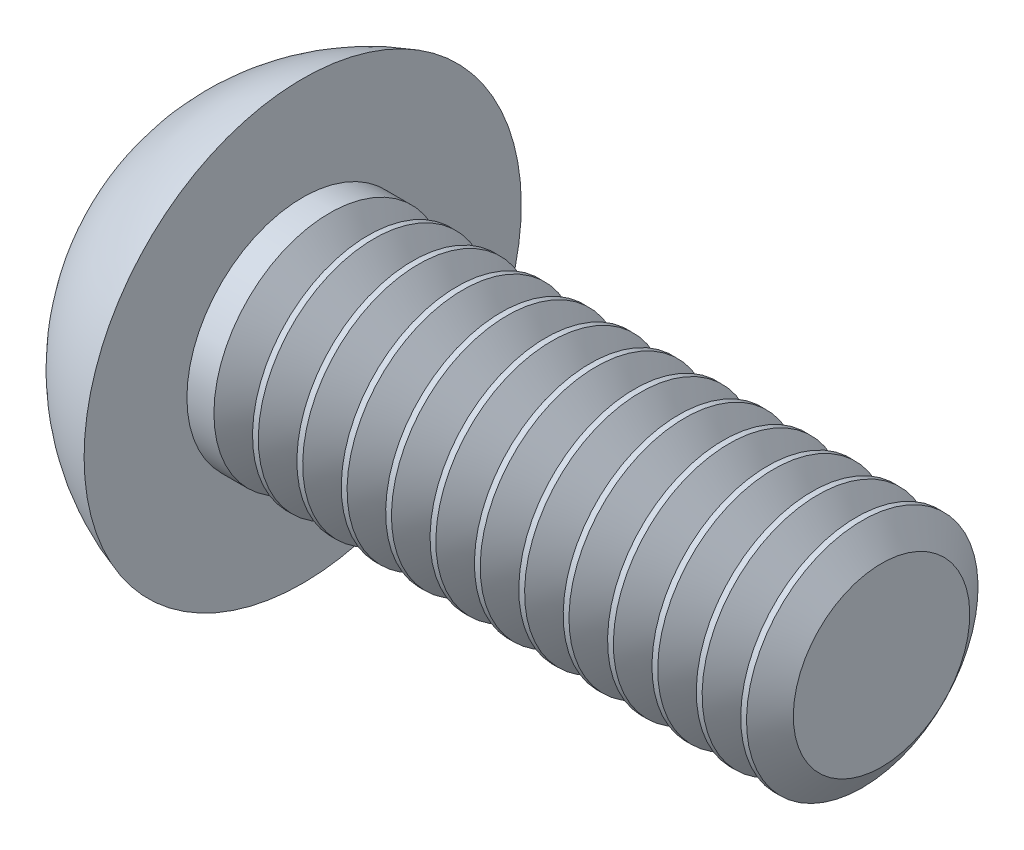
ISO-10303-21;
HEADER;
FILE_DESCRIPTION(('STEP AP214'),'2;1');
FILE_NAME('part.step','',(''),(''),'','','');
FILE_SCHEMA(('AUTOMOTIVE_DESIGN { 1 0 10303 214 1 1 1 1 }'));
ENDSEC;
DATA;
#1=APPLICATION_CONTEXT('core data for automotive mechanical design processes');
#2=APPLICATION_PROTOCOL_DEFINITION('international standard','automotive_design',2000,#1);
#3=PRODUCT_CONTEXT('',#1,'mechanical');
#4=PRODUCT('Part','Part','',(#3));
#5=PRODUCT_RELATED_PRODUCT_CATEGORY('part','',(#4));
#6=PRODUCT_DEFINITION_FORMATION('','',#4);
#7=PRODUCT_DEFINITION_CONTEXT('part definition',#1,'design');
#8=PRODUCT_DEFINITION('design','',#6,#7);
#9=PRODUCT_DEFINITION_SHAPE('','',#8);
#10=(LENGTH_UNIT() NAMED_UNIT(*) SI_UNIT(.MILLI.,.METRE.));
#11=(NAMED_UNIT(*) PLANE_ANGLE_UNIT() SI_UNIT($,.RADIAN.));
#12=(NAMED_UNIT(*) SI_UNIT($,.STERADIAN.) SOLID_ANGLE_UNIT());
#13=UNCERTAINTY_MEASURE_WITH_UNIT(LENGTH_MEASURE(1.E-05),#10,'distance_accuracy_value','');
#14=(GEOMETRIC_REPRESENTATION_CONTEXT(3) GLOBAL_UNCERTAINTY_ASSIGNED_CONTEXT((#13)) GLOBAL_UNIT_ASSIGNED_CONTEXT((#10,
#11,#12)) REPRESENTATION_CONTEXT('',''));
#15=CARTESIAN_POINT('',(0.,0.,0.));
#16=DIRECTION('',(0.,0.,1.));
#17=DIRECTION('',(1.,0.,0.));
#18=AXIS2_PLACEMENT_3D('',#15,#16,#17);
#19=CARTESIAN_POINT('',(6.26443828571429,0.,0.));
#20=DIRECTION('',(-1.,0.,0.));
#21=DIRECTION('',(0.,1.,0.));
#22=AXIS2_PLACEMENT_3D('',#19,#20,#21);
#23=SPHERICAL_SURFACE('',#22,6.26443828571429);
#24=CARTESIAN_POINT('',(4.445,0.,0.));
#25=DIRECTION('',(-1.,0.,0.));
#26=DIRECTION('',(0.,0.,1.));
#27=AXIS2_PLACEMENT_3D('',#24,#25,#26);
#28=CIRCLE('',#27,5.9944);
#29=CARTESIAN_POINT('',(4.445,0.,5.9944));
#30=VERTEX_POINT('',#29);
#31=EDGE_CURVE('E149',#30,#30,#28,.T.);
#32=ORIENTED_EDGE('',*,*,#31,.T.);
#33=EDGE_LOOP('',(#32));
#34=FACE_BOUND('',#33,.T.);
#35=CARTESIAN_POINT('',(6.28064975308404,0.,0.217353747698152));
#36=DIRECTION('',(-0.0743790363670983,0.,-0.997230043144059));
#37=DIRECTION('',(-0.997230043144059,0.,0.0743790363670983));
#38=AXIS2_PLACEMENT_3D('',#35,#36,#37);
#39=CIRCLE('',#38,6.26064545971182);
#40=CARTESIAN_POINT('',(0.911072898031812,3.19420273080412,0.617847049041826));
#41=VERTEX_POINT('',#40);
#42=CARTESIAN_POINT('',(0.0743101433211451,0.680257530746763,0.680257530746765));
#43=VERTEX_POINT('',#42);
#44=EDGE_CURVE('E123',#41,#43,#39,.F.);
#45=ORIENTED_EDGE('',*,*,#44,.T.);
#46=CARTESIAN_POINT('',(6.28064975308404,0.217353747698152,0.));
#47=DIRECTION('',(-0.0743790363670983,-0.997230043144059,0.));
#48=DIRECTION('',(0.997230043144059,-0.0743790363670983,0.));
#49=AXIS2_PLACEMENT_3D('',#46,#47,#48);
#50=CIRCLE('',#49,6.26064545971182);
#51=CARTESIAN_POINT('',(0.911072898031812,0.617847049041815,3.19420273080413));
#52=VERTEX_POINT('',#51);
#53=EDGE_CURVE('E105',#43,#52,#50,.F.);
#54=ORIENTED_EDGE('',*,*,#53,.T.);
#55=CARTESIAN_POINT('',(5.80637093787907,0.,-0.592215642558393));
#56=DIRECTION('',(0.611820563359384,0.,0.79099658548606));
#57=DIRECTION('',(0.79099658548606,0.,-0.611820563359384));
#58=AXIS2_PLACEMENT_3D('',#55,#56,#57);
#59=CIRCLE('',#58,6.21953711887623);
#60=CARTESIAN_POINT('',(0.911072898031812,-0.617847049041838,3.19420273080412));
#61=VERTEX_POINT('',#60);
#62=EDGE_CURVE('E116',#61,#52,#59,.F.);
#63=ORIENTED_EDGE('',*,*,#62,.F.);
#64=CARTESIAN_POINT('',(6.28064975308404,-0.217353747698152,0.));
#65=DIRECTION('',(-0.0743790363670983,0.997230043144059,0.));
#66=DIRECTION('',(-0.997230043144059,-0.0743790363670983,0.));
#67=AXIS2_PLACEMENT_3D('',#64,#65,#66);
#68=CIRCLE('',#67,6.26064545971182);
#69=CARTESIAN_POINT('',(0.0743101433211451,-0.680257530746768,0.680257530746765));
#70=VERTEX_POINT('',#69);
#71=EDGE_CURVE('E179',#61,#70,#68,.F.);
#72=ORIENTED_EDGE('',*,*,#71,.T.);
#73=CARTESIAN_POINT('',(0.911072898031812,-3.19420273080412,0.617847049041826));
#74=VERTEX_POINT('',#73);
#75=EDGE_CURVE('E154',#70,#74,#39,.F.);
#76=ORIENTED_EDGE('',*,*,#75,.T.);
#77=CARTESIAN_POINT('',(5.80637093787907,0.592215642558393,0.));
#78=DIRECTION('',(0.611820563359384,-0.79099658548606,0.));
#79=DIRECTION('',(0.79099658548606,0.611820563359384,0.));
#80=AXIS2_PLACEMENT_3D('',#77,#78,#79);
#81=CIRCLE('',#80,6.21953711887623);
#82=CARTESIAN_POINT('',(0.911072898031812,-3.19420273080412,-0.617847049041826));
#83=VERTEX_POINT('',#82);
#84=EDGE_CURVE('E152',#83,#74,#81,.F.);
#85=ORIENTED_EDGE('',*,*,#84,.F.);
#86=CARTESIAN_POINT('',(6.28064975308404,0.,-0.217353747698152));
#87=DIRECTION('',(-0.0743790363670983,0.,0.997230043144059));
#88=DIRECTION('',(0.997230043144059,0.,0.0743790363670983));
#89=AXIS2_PLACEMENT_3D('',#86,#87,#88);
#90=CIRCLE('',#89,6.26064545971182);
#91=CARTESIAN_POINT('',(0.0743101433211451,-0.680257530746763,-0.680257530746765));
#92=VERTEX_POINT('',#91);
#93=EDGE_CURVE('E156',#83,#92,#90,.F.);
#94=ORIENTED_EDGE('',*,*,#93,.T.);
#95=CARTESIAN_POINT('',(0.911072898031812,-0.617847049041814,-3.19420273080413));
#96=VERTEX_POINT('',#95);
#97=EDGE_CURVE('E183',#92,#96,#68,.F.);
#98=ORIENTED_EDGE('',*,*,#97,.T.);
#99=CARTESIAN_POINT('',(5.80637093787907,0.,0.592215642558393));
#100=DIRECTION('',(0.611820563359384,0.,-0.79099658548606));
#101=DIRECTION('',(-0.79099658548606,0.,-0.611820563359384));
#102=AXIS2_PLACEMENT_3D('',#99,#100,#101);
#103=CIRCLE('',#102,6.21953711887623);
#104=CARTESIAN_POINT('',(0.911072898031812,0.617847049041838,-3.19420273080412));
#105=VERTEX_POINT('',#104);
#106=EDGE_CURVE('E117',#105,#96,#103,.F.);
#107=ORIENTED_EDGE('',*,*,#106,.F.);
#108=CARTESIAN_POINT('',(0.0743101433211451,0.680257530746768,-0.680257530746765));
#109=VERTEX_POINT('',#108);
#110=EDGE_CURVE('E142',#105,#109,#50,.F.);
#111=ORIENTED_EDGE('',*,*,#110,.T.);
#112=CARTESIAN_POINT('',(0.911072898031812,3.19420273080412,-0.617847049041826));
#113=VERTEX_POINT('',#112);
#114=EDGE_CURVE('E56',#109,#113,#90,.F.);
#115=ORIENTED_EDGE('',*,*,#114,.T.);
#116=CARTESIAN_POINT('',(5.80637093787907,-0.592215642558393,0.));
#117=DIRECTION('',(0.611820563359384,0.79099658548606,0.));
#118=DIRECTION('',(-0.79099658548606,0.611820563359384,0.));
#119=AXIS2_PLACEMENT_3D('',#116,#117,#118);
#120=CIRCLE('',#119,6.21953711887623);
#121=EDGE_CURVE('E41',#41,#113,#120,.F.);
#122=ORIENTED_EDGE('',*,*,#121,.F.);
#123=EDGE_LOOP('',(#45,#54,#63,#72,#76,#85,#94,#98,#107,#111,#115,#122));
#124=FACE_BOUND('',#123,.T.);
#125=ADVANCED_FACE('F34',(#34,#124),#23,.T.);
#126=CARTESIAN_POINT('',(5.04072071428571,0.,-0.309834642857143));
#127=DIRECTION('',(-0.0743790363670983,0.,0.997230043144059));
#128=DIRECTION('',(0.997230043144059,0.,0.0743790363670983));
#129=AXIS2_PLACEMENT_3D('',#126,#127,#128);
#130=PLANE('',#129);
#131=ORIENTED_EDGE('',*,*,#114,.F.);
#132=DIRECTION('',(0.994482977484925,-0.0741741447295389,0.0741741447295386));
#133=VECTOR('',#132,1.);
#134=CARTESIAN_POINT('',(5.06357564326253,0.308129993458321,-0.30812999345832));
#135=LINE('',#134,#133);
#136=CARTESIAN_POINT('',(4.5974,0.342900000000001,-0.342899999999999));
#137=VERTEX_POINT('',#136);
#138=EDGE_CURVE('E161',#109,#137,#135,.T.);
#139=ORIENTED_EDGE('',*,*,#138,.T.);
#140=DIRECTION('',(0.789623579899994,-0.610758570088394,0.0588945764013808));
#141=VECTOR('',#140,1.);
#142=CARTESIAN_POINT('',(0.,3.8989,-0.6858));
#143=LINE('',#142,#141);
#144=EDGE_CURVE('E126',#113,#137,#143,.T.);
#145=ORIENTED_EDGE('',*,*,#144,.F.);
#146=EDGE_LOOP('',(#131,#139,#145));
#147=FACE_BOUND('',#146,.T.);
#148=ADVANCED_FACE('F160',(#147),#130,.T.);
#149=DIRECTION('',(0.789623579899994,0.610758570088394,0.0588945764013808));
#150=VECTOR('',#149,1.);
#151=CARTESIAN_POINT('',(0.,-3.8989,-0.6858));
#152=LINE('',#151,#150);
#153=CARTESIAN_POINT('',(4.5974,-0.3429,-0.3429));
#154=VERTEX_POINT('',#153);
#155=EDGE_CURVE('E48',#83,#154,#152,.T.);
#156=ORIENTED_EDGE('',*,*,#155,.T.);
#157=DIRECTION('',(-0.994482977484925,-0.0741741447295384,-0.0741741447295386));
#158=VECTOR('',#157,1.);
#159=CARTESIAN_POINT('',(5.06357564326253,-0.308129993458319,-0.30812999345832));
#160=LINE('',#159,#158);
#161=EDGE_CURVE('E181',#154,#92,#160,.T.);
#162=ORIENTED_EDGE('',*,*,#161,.T.);
#163=ORIENTED_EDGE('',*,*,#93,.F.);
#164=EDGE_LOOP('',(#156,#162,#163));
#165=FACE_BOUND('',#164,.T.);
#166=ADVANCED_FACE('F335',(#165),#130,.T.);
#167=CARTESIAN_POINT('',(5.04072071428571,0.,0.309834642857143));
#168=DIRECTION('',(-0.0743790363670983,0.,-0.997230043144059));
#169=DIRECTION('',(-0.997230043144059,0.,0.0743790363670983));
#170=AXIS2_PLACEMENT_3D('',#167,#168,#169);
#171=PLANE('',#170);
#172=DIRECTION('',(0.789623579899994,-0.610758570088394,-0.0588945764013808));
#173=VECTOR('',#172,1.);
#174=CARTESIAN_POINT('',(0.,3.8989,0.6858));
#175=LINE('',#174,#173);
#176=CARTESIAN_POINT('',(4.5974,0.342899999999999,0.342900000000001));
#177=VERTEX_POINT('',#176);
#178=EDGE_CURVE('E121',#41,#177,#175,.T.);
#179=ORIENTED_EDGE('',*,*,#178,.T.);
#180=DIRECTION('',(-0.994482977484925,0.0741741447295384,0.0741741447295386));
#181=VECTOR('',#180,1.);
#182=CARTESIAN_POINT('',(5.06357564326253,0.308129993458319,0.30812999345832));
#183=LINE('',#182,#181);
#184=EDGE_CURVE('E11',#177,#43,#183,.T.);
#185=ORIENTED_EDGE('',*,*,#184,.T.);
#186=ORIENTED_EDGE('',*,*,#44,.F.);
#187=EDGE_LOOP('',(#179,#185,#186));
#188=FACE_BOUND('',#187,.T.);
#189=ADVANCED_FACE('F122',(#188),#171,.T.);
#190=ORIENTED_EDGE('',*,*,#75,.F.);
#191=DIRECTION('',(0.994482977484925,0.0741741447295389,-0.0741741447295386));
#192=VECTOR('',#191,1.);
#193=CARTESIAN_POINT('',(5.06357564326253,-0.308129993458321,0.30812999345832));
#194=LINE('',#193,#192);
#195=CARTESIAN_POINT('',(4.5974,-0.3429,0.3429));
#196=VERTEX_POINT('',#195);
#197=EDGE_CURVE('E176',#70,#196,#194,.T.);
#198=ORIENTED_EDGE('',*,*,#197,.T.);
#199=DIRECTION('',(0.789623579899994,0.610758570088394,-0.0588945764013807));
#200=VECTOR('',#199,1.);
#201=CARTESIAN_POINT('',(0.,-3.8989,0.685799999999999));
#202=LINE('',#201,#200);
#203=EDGE_CURVE('E167',#74,#196,#202,.T.);
#204=ORIENTED_EDGE('',*,*,#203,.F.);
#205=EDGE_LOOP('',(#190,#198,#204));
#206=FACE_BOUND('',#205,.T.);
#207=ADVANCED_FACE('F175',(#206),#171,.T.);
#208=CARTESIAN_POINT('',(4.445,3.175,0.));
#209=DIRECTION('',(-1.,0.,0.));
#210=DIRECTION('',(0.,0.,1.));
#211=AXIS2_PLACEMENT_3D('',#208,#209,#210);
#212=PLANE('',#211);
#213=ORIENTED_EDGE('',*,*,#31,.F.);
#214=EDGE_LOOP('',(#213));
#215=FACE_BOUND('',#214,.T.);
#216=CARTESIAN_POINT('',(4.445,0.,0.));
#217=DIRECTION('',(-1.,0.,0.));
#218=DIRECTION('',(0.,0.,1.));
#219=AXIS2_PLACEMENT_3D('',#216,#217,#218);
#220=CIRCLE('',#219,3.175);
#221=CARTESIAN_POINT('',(4.445,0.,3.175));
#222=VERTEX_POINT('',#221);
#223=EDGE_CURVE('E146',#222,#222,#220,.T.);
#224=ORIENTED_EDGE('',*,*,#223,.T.);
#225=EDGE_LOOP('',(#224));
#226=FACE_BOUND('',#225,.T.);
#227=ADVANCED_FACE('F339',(#215,#226),#212,.F.);
#228=CARTESIAN_POINT('',(0.,0.,0.));
#229=DIRECTION('',(-1.,0.,0.));
#230=DIRECTION('',(0.,0.,1.));
#231=AXIS2_PLACEMENT_3D('',#228,#229,#230);
#232=CYLINDRICAL_SURFACE('',#231,3.175);
#233=CARTESIAN_POINT('',(5.18588817375183,0.,0.));
#234=DIRECTION('',(-1.,0.,0.));
#235=DIRECTION('',(0.,-1.,0.));
#236=AXIS2_PLACEMENT_3D('',#233,#234,#235);
#237=CIRCLE('',#236,3.175);
#238=CARTESIAN_POINT('',(5.18588817375183,-3.175,0.));
#239=VERTEX_POINT('',#238);
#240=EDGE_CURVE('E205',#239,#239,#237,.T.);
#241=ORIENTED_EDGE('',*,*,#240,.T.);
#242=EDGE_LOOP('',(#241));
#243=FACE_BOUND('',#242,.T.);
#244=ORIENTED_EDGE('',*,*,#223,.F.);
#245=EDGE_LOOP('',(#244));
#246=FACE_BOUND('',#245,.T.);
#247=ADVANCED_FACE('F342',(#243,#246),#232,.T.);
#248=CARTESIAN_POINT('',(4.5974,0.3429,-0.3429));
#249=DIRECTION('',(-1.,0.,0.));
#250=DIRECTION('',(0.,0.,1.));
#251=AXIS2_PLACEMENT_3D('',#248,#249,#250);
#252=PLANE('',#251);
#253=DIRECTION('',(0.,1.,0.));
#254=VECTOR('',#253,1.);
#255=CARTESIAN_POINT('',(4.5974,-0.3429,-0.3429));
#256=LINE('',#255,#254);
#257=EDGE_CURVE('E139',#154,#137,#256,.T.);
#258=ORIENTED_EDGE('',*,*,#257,.F.);
#259=DIRECTION('',(0.,0.,1.));
#260=VECTOR('',#259,1.);
#261=CARTESIAN_POINT('',(4.5974,-0.3429,-0.3429));
#262=LINE('',#261,#260);
#263=EDGE_CURVE('E134',#154,#196,#262,.T.);
#264=ORIENTED_EDGE('',*,*,#263,.T.);
#265=DIRECTION('',(0.,-1.,0.));
#266=VECTOR('',#265,1.);
#267=CARTESIAN_POINT('',(4.5974,0.3429,0.3429));
#268=LINE('',#267,#266);
#269=EDGE_CURVE('E113',#177,#196,#268,.T.);
#270=ORIENTED_EDGE('',*,*,#269,.F.);
#271=DIRECTION('',(0.,0.,-1.));
#272=VECTOR('',#271,1.);
#273=CARTESIAN_POINT('',(4.5974,0.3429,0.3429));
#274=LINE('',#273,#272);
#275=EDGE_CURVE('E133',#177,#137,#274,.T.);
#276=ORIENTED_EDGE('',*,*,#275,.T.);
#277=EDGE_LOOP('',(#258,#264,#270,#276));
#278=FACE_BOUND('',#277,.T.);
#279=ADVANCED_FACE('F132',(#278),#252,.T.);
#280=CARTESIAN_POINT('',(4.5974,0.3429,0.3429));
#281=DIRECTION('',(0.611820563359384,0.79099658548606,0.));
#282=DIRECTION('',(-0.79099658548606,0.611820563359384,0.));
#283=AXIS2_PLACEMENT_3D('',#280,#281,#282);
#284=PLANE('',#283);
#285=ORIENTED_EDGE('',*,*,#121,.T.);
#286=ORIENTED_EDGE('',*,*,#144,.T.);
#287=ORIENTED_EDGE('',*,*,#275,.F.);
#288=ORIENTED_EDGE('',*,*,#178,.F.);
#289=EDGE_LOOP('',(#285,#286,#287,#288));
#290=FACE_BOUND('',#289,.T.);
#291=ADVANCED_FACE('F137',(#290),#284,.F.);
#292=CARTESIAN_POINT('',(4.5974,-0.3429,-0.3429));
#293=DIRECTION('',(0.611820563359384,-0.79099658548606,0.));
#294=DIRECTION('',(0.79099658548606,0.611820563359384,0.));
#295=AXIS2_PLACEMENT_3D('',#292,#293,#294);
#296=PLANE('',#295);
#297=ORIENTED_EDGE('',*,*,#84,.T.);
#298=ORIENTED_EDGE('',*,*,#203,.T.);
#299=ORIENTED_EDGE('',*,*,#263,.F.);
#300=ORIENTED_EDGE('',*,*,#155,.F.);
#301=EDGE_LOOP('',(#297,#298,#299,#300));
#302=FACE_BOUND('',#301,.T.);
#303=ADVANCED_FACE('F170',(#302),#296,.F.);
#304=CARTESIAN_POINT('',(5.04072071428571,0.309834642857143,0.));
#305=DIRECTION('',(-0.0743790363670983,-0.997230043144059,0.));
#306=DIRECTION('',(0.997230043144059,-0.0743790363670983,0.));
#307=AXIS2_PLACEMENT_3D('',#304,#305,#306);
#308=PLANE('',#307);
#309=ORIENTED_EDGE('',*,*,#184,.F.);
#310=DIRECTION('',(0.789623579899994,-0.0588945764013786,-0.610758570088394));
#311=VECTOR('',#310,1.);
#312=CARTESIAN_POINT('',(0.,0.685799999999986,3.8989));
#313=LINE('',#312,#311);
#314=EDGE_CURVE('E103',#52,#177,#313,.T.);
#315=ORIENTED_EDGE('',*,*,#314,.F.);
#316=ORIENTED_EDGE('',*,*,#53,.F.);
#317=EDGE_LOOP('',(#309,#315,#316));
#318=FACE_BOUND('',#317,.T.);
#319=ADVANCED_FACE('F102',(#318),#308,.T.);
#320=CARTESIAN_POINT('',(5.04072071428571,-0.309834642857143,0.));
#321=DIRECTION('',(-0.0743790363670983,0.997230043144059,0.));
#322=DIRECTION('',(-0.997230043144059,-0.0743790363670983,0.));
#323=AXIS2_PLACEMENT_3D('',#320,#321,#322);
#324=PLANE('',#323);
#325=DIRECTION('',(0.789623579899994,0.058894576401383,-0.610758570088393));
#326=VECTOR('',#325,1.);
#327=CARTESIAN_POINT('',(0.,-0.685800000000014,3.8989));
#328=LINE('',#327,#326);
#329=EDGE_CURVE('E118',#61,#196,#328,.T.);
#330=ORIENTED_EDGE('',*,*,#329,.T.);
#331=ORIENTED_EDGE('',*,*,#197,.F.);
#332=ORIENTED_EDGE('',*,*,#71,.F.);
#333=EDGE_LOOP('',(#330,#331,#332));
#334=FACE_BOUND('',#333,.T.);
#335=ADVANCED_FACE('F527',(#334),#324,.T.);
#336=CARTESIAN_POINT('',(4.5974,-0.342900000000001,0.342899999999999));
#337=DIRECTION('',(0.611820563359384,0.,0.79099658548606));
#338=DIRECTION('',(-0.79099658548606,0.,0.611820563359384));
#339=AXIS2_PLACEMENT_3D('',#336,#337,#338);
#340=PLANE('',#339);
#341=ORIENTED_EDGE('',*,*,#62,.T.);
#342=ORIENTED_EDGE('',*,*,#314,.T.);
#343=ORIENTED_EDGE('',*,*,#269,.T.);
#344=ORIENTED_EDGE('',*,*,#329,.F.);
#345=EDGE_LOOP('',(#341,#342,#343,#344));
#346=FACE_BOUND('',#345,.T.);
#347=ADVANCED_FACE('F110',(#346),#340,.F.);
#348=DIRECTION('',(0.789623579899994,-0.0588945764013829,0.610758570088393));
#349=VECTOR('',#348,1.);
#350=CARTESIAN_POINT('',(0.,0.685800000000014,-3.8989));
#351=LINE('',#350,#349);
#352=EDGE_CURVE('E194',#105,#137,#351,.T.);
#353=ORIENTED_EDGE('',*,*,#352,.T.);
#354=ORIENTED_EDGE('',*,*,#138,.F.);
#355=ORIENTED_EDGE('',*,*,#110,.F.);
#356=EDGE_LOOP('',(#353,#354,#355));
#357=FACE_BOUND('',#356,.T.);
#358=ADVANCED_FACE('F193',(#357),#308,.T.);
#359=ORIENTED_EDGE('',*,*,#161,.F.);
#360=DIRECTION('',(0.789623579899994,0.0588945764013786,0.610758570088394));
#361=VECTOR('',#360,1.);
#362=CARTESIAN_POINT('',(0.,-0.685799999999986,-3.8989));
#363=LINE('',#362,#361);
#364=EDGE_CURVE('E198',#96,#154,#363,.T.);
#365=ORIENTED_EDGE('',*,*,#364,.F.);
#366=ORIENTED_EDGE('',*,*,#97,.F.);
#367=EDGE_LOOP('',(#359,#365,#366));
#368=FACE_BOUND('',#367,.T.);
#369=ADVANCED_FACE('F532',(#368),#324,.T.);
#370=CARTESIAN_POINT('',(4.5974,0.342900000000001,-0.342899999999999));
#371=DIRECTION('',(0.611820563359384,0.,-0.79099658548606));
#372=DIRECTION('',(0.79099658548606,0.,0.611820563359384));
#373=AXIS2_PLACEMENT_3D('',#370,#371,#372);
#374=PLANE('',#373);
#375=ORIENTED_EDGE('',*,*,#106,.T.);
#376=ORIENTED_EDGE('',*,*,#364,.T.);
#377=ORIENTED_EDGE('',*,*,#257,.T.);
#378=ORIENTED_EDGE('',*,*,#352,.F.);
#379=EDGE_LOOP('',(#375,#376,#377,#378));
#380=FACE_BOUND('',#379,.T.);
#381=ADVANCED_FACE('F196',(#380),#374,.F.);
#382=CARTESIAN_POINT('',(6.24411182624816,0.,0.));
#383=DIRECTION('',(1.,0.,0.));
#384=DIRECTION('',(0.,1.,0.));
#385=AXIS2_PLACEMENT_3D('',#382,#383,#384);
#386=CONICAL_SURFACE('',#385,3.175,0.959931088596884);
#387=CARTESIAN_POINT('',(5.715,0.,0.));
#388=DIRECTION('',(-1.,0.,0.));
#389=DIRECTION('',(0.,-1.,0.));
#390=AXIS2_PLACEMENT_3D('',#387,#388,#389);
#391=CIRCLE('',#390,2.41935);
#392=CARTESIAN_POINT('',(5.715,-2.41935,0.));
#393=VERTEX_POINT('',#392);
#394=EDGE_CURVE('E208',#393,#393,#391,.T.);
#395=ORIENTED_EDGE('',*,*,#394,.F.);
#396=EDGE_LOOP('',(#395));
#397=FACE_BOUND('',#396,.T.);
#398=CARTESIAN_POINT('',(6.24411182624816,0.,0.));
#399=DIRECTION('',(-1.,0.,0.));
#400=DIRECTION('',(0.,-1.,0.));
#401=AXIS2_PLACEMENT_3D('',#398,#399,#400);
#402=CIRCLE('',#401,3.175);
#403=CARTESIAN_POINT('',(6.24411182624816,-3.175,0.));
#404=VERTEX_POINT('',#403);
#405=EDGE_CURVE('E201',#404,#404,#402,.T.);
#406=ORIENTED_EDGE('',*,*,#405,.T.);
#407=EDGE_LOOP('',(#406));
#408=FACE_BOUND('',#407,.T.);
#409=ADVANCED_FACE('F367',(#397,#408),#386,.T.);
#410=CARTESIAN_POINT('',(5.715,0.,0.));
#411=DIRECTION('',(-1.,0.,0.));
#412=DIRECTION('',(0.,-1.,0.));
#413=AXIS2_PLACEMENT_3D('',#410,#411,#412);
#414=CONICAL_SURFACE('',#413,2.41935,0.959931088596876);
#415=ORIENTED_EDGE('',*,*,#240,.F.);
#416=EDGE_LOOP('',(#415));
#417=FACE_BOUND('',#416,.T.);
#418=ORIENTED_EDGE('',*,*,#394,.T.);
#419=EDGE_LOOP('',(#418));
#420=FACE_BOUND('',#419,.T.);
#421=ADVANCED_FACE('F357',(#417,#420),#414,.T.);
#422=CARTESIAN_POINT('',(6.40297150708516,0.,0.));
#423=DIRECTION('',(-1.,0.,0.));
#424=DIRECTION('',(0.,-1.,0.));
#425=AXIS2_PLACEMENT_3D('',#422,#423,#424);
#426=CIRCLE('',#425,3.175);
#427=CARTESIAN_POINT('',(6.40297150708516,-3.175,0.));
#428=VERTEX_POINT('',#427);
#429=EDGE_CURVE('E214',#428,#428,#426,.T.);
#430=ORIENTED_EDGE('',*,*,#429,.T.);
#431=EDGE_LOOP('',(#430));
#432=FACE_BOUND('',#431,.T.);
#433=ORIENTED_EDGE('',*,*,#405,.F.);
#434=EDGE_LOOP('',(#433));
#435=FACE_BOUND('',#434,.T.);
#436=ADVANCED_FACE('F347',(#432,#435),#232,.T.);
#437=CARTESIAN_POINT('',(7.4611951595815,0.,0.));
#438=DIRECTION('',(1.,0.,0.));
#439=DIRECTION('',(0.,1.,0.));
#440=AXIS2_PLACEMENT_3D('',#437,#438,#439);
#441=CONICAL_SURFACE('',#440,3.175,0.959931088596884);
#442=CARTESIAN_POINT('',(6.93208333333333,0.,0.));
#443=DIRECTION('',(-1.,0.,0.));
#444=DIRECTION('',(0.,-1.,0.));
#445=AXIS2_PLACEMENT_3D('',#442,#443,#444);
#446=CIRCLE('',#445,2.41935);
#447=CARTESIAN_POINT('',(6.93208333333333,-2.41935,0.));
#448=VERTEX_POINT('',#447);
#449=EDGE_CURVE('E217',#448,#448,#446,.T.);
#450=ORIENTED_EDGE('',*,*,#449,.F.);
#451=EDGE_LOOP('',(#450));
#452=FACE_BOUND('',#451,.T.);
#453=CARTESIAN_POINT('',(7.4611951595815,0.,0.));
#454=DIRECTION('',(-1.,0.,0.));
#455=DIRECTION('',(0.,-1.,0.));
#456=AXIS2_PLACEMENT_3D('',#453,#454,#455);
#457=CIRCLE('',#456,3.175);
#458=CARTESIAN_POINT('',(7.4611951595815,-3.175,0.));
#459=VERTEX_POINT('',#458);
#460=EDGE_CURVE('E211',#459,#459,#457,.T.);
#461=ORIENTED_EDGE('',*,*,#460,.T.);
#462=EDGE_LOOP('',(#461));
#463=FACE_BOUND('',#462,.T.);
#464=ADVANCED_FACE('F356',(#452,#463),#441,.T.);
#465=CARTESIAN_POINT('',(6.93208333333333,0.,0.));
#466=DIRECTION('',(-1.,0.,0.));
#467=DIRECTION('',(0.,-1.,0.));
#468=AXIS2_PLACEMENT_3D('',#465,#466,#467);
#469=CONICAL_SURFACE('',#468,2.41935,0.959931088596876);
#470=ORIENTED_EDGE('',*,*,#429,.F.);
#471=EDGE_LOOP('',(#470));
#472=FACE_BOUND('',#471,.T.);
#473=ORIENTED_EDGE('',*,*,#449,.T.);
#474=EDGE_LOOP('',(#473));
#475=FACE_BOUND('',#474,.T.);
#476=ADVANCED_FACE('F364',(#472,#475),#469,.T.);
#477=CARTESIAN_POINT('',(7.62005484041849,0.,0.));
#478=DIRECTION('',(-1.,0.,0.));
#479=DIRECTION('',(0.,-1.,0.));
#480=AXIS2_PLACEMENT_3D('',#477,#478,#479);
#481=CIRCLE('',#480,3.175);
#482=CARTESIAN_POINT('',(7.62005484041849,-3.175,0.));
#483=VERTEX_POINT('',#482);
#484=EDGE_CURVE('E223',#483,#483,#481,.T.);
#485=ORIENTED_EDGE('',*,*,#484,.T.);
#486=EDGE_LOOP('',(#485));
#487=FACE_BOUND('',#486,.T.);
#488=ORIENTED_EDGE('',*,*,#460,.F.);
#489=EDGE_LOOP('',(#488));
#490=FACE_BOUND('',#489,.T.);
#491=ADVANCED_FACE('F359',(#487,#490),#232,.T.);
#492=CARTESIAN_POINT('',(8.67827849291483,0.,0.));
#493=DIRECTION('',(1.,0.,0.));
#494=DIRECTION('',(0.,1.,0.));
#495=AXIS2_PLACEMENT_3D('',#492,#493,#494);
#496=CONICAL_SURFACE('',#495,3.175,0.959931088596884);
#497=CARTESIAN_POINT('',(8.14916666666667,0.,0.));
#498=DIRECTION('',(-1.,0.,0.));
#499=DIRECTION('',(0.,-1.,0.));
#500=AXIS2_PLACEMENT_3D('',#497,#498,#499);
#501=CIRCLE('',#500,2.41935);
#502=CARTESIAN_POINT('',(8.14916666666667,-2.41935,0.));
#503=VERTEX_POINT('',#502);
#504=EDGE_CURVE('E226',#503,#503,#501,.T.);
#505=ORIENTED_EDGE('',*,*,#504,.F.);
#506=EDGE_LOOP('',(#505));
#507=FACE_BOUND('',#506,.T.);
#508=CARTESIAN_POINT('',(8.67827849291483,0.,0.));
#509=DIRECTION('',(-1.,0.,0.));
#510=DIRECTION('',(0.,-1.,0.));
#511=AXIS2_PLACEMENT_3D('',#508,#509,#510);
#512=CIRCLE('',#511,3.175);
#513=CARTESIAN_POINT('',(8.67827849291483,-3.175,0.));
#514=VERTEX_POINT('',#513);
#515=EDGE_CURVE('E220',#514,#514,#512,.T.);
#516=ORIENTED_EDGE('',*,*,#515,.T.);
#517=EDGE_LOOP('',(#516));
#518=FACE_BOUND('',#517,.T.);
#519=ADVANCED_FACE('F372',(#507,#518),#496,.T.);
#520=CARTESIAN_POINT('',(8.14916666666667,0.,0.));
#521=DIRECTION('',(-1.,0.,0.));
#522=DIRECTION('',(0.,-1.,0.));
#523=AXIS2_PLACEMENT_3D('',#520,#521,#522);
#524=CONICAL_SURFACE('',#523,2.41935,0.959931088596876);
#525=ORIENTED_EDGE('',*,*,#484,.F.);
#526=EDGE_LOOP('',(#525));
#527=FACE_BOUND('',#526,.T.);
#528=ORIENTED_EDGE('',*,*,#504,.T.);
#529=EDGE_LOOP('',(#528));
#530=FACE_BOUND('',#529,.T.);
#531=ADVANCED_FACE('F379',(#527,#530),#524,.T.);
#532=CARTESIAN_POINT('',(8.83713817375183,0.,0.));
#533=DIRECTION('',(-1.,0.,0.));
#534=DIRECTION('',(0.,-1.,0.));
#535=AXIS2_PLACEMENT_3D('',#532,#533,#534);
#536=CIRCLE('',#535,3.175);
#537=CARTESIAN_POINT('',(8.83713817375183,-3.175,0.));
#538=VERTEX_POINT('',#537);
#539=EDGE_CURVE('E232',#538,#538,#536,.T.);
#540=ORIENTED_EDGE('',*,*,#539,.T.);
#541=EDGE_LOOP('',(#540));
#542=FACE_BOUND('',#541,.T.);
#543=ORIENTED_EDGE('',*,*,#515,.F.);
#544=EDGE_LOOP('',(#543));
#545=FACE_BOUND('',#544,.T.);
#546=ADVANCED_FACE('F374',(#542,#545),#232,.T.);
#547=CARTESIAN_POINT('',(9.89536182624816,0.,0.));
#548=DIRECTION('',(1.,0.,0.));
#549=DIRECTION('',(0.,1.,0.));
#550=AXIS2_PLACEMENT_3D('',#547,#548,#549);
#551=CONICAL_SURFACE('',#550,3.175,0.959931088596884);
#552=CARTESIAN_POINT('',(9.36625,0.,0.));
#553=DIRECTION('',(-1.,0.,0.));
#554=DIRECTION('',(0.,-1.,0.));
#555=AXIS2_PLACEMENT_3D('',#552,#553,#554);
#556=CIRCLE('',#555,2.41935);
#557=CARTESIAN_POINT('',(9.36625,-2.41935,0.));
#558=VERTEX_POINT('',#557);
#559=EDGE_CURVE('E235',#558,#558,#556,.T.);
#560=ORIENTED_EDGE('',*,*,#559,.F.);
#561=EDGE_LOOP('',(#560));
#562=FACE_BOUND('',#561,.T.);
#563=CARTESIAN_POINT('',(9.89536182624816,0.,0.));
#564=DIRECTION('',(-1.,0.,0.));
#565=DIRECTION('',(0.,-1.,0.));
#566=AXIS2_PLACEMENT_3D('',#563,#564,#565);
#567=CIRCLE('',#566,3.175);
#568=CARTESIAN_POINT('',(9.89536182624816,-3.175,0.));
#569=VERTEX_POINT('',#568);
#570=EDGE_CURVE('E229',#569,#569,#567,.T.);
#571=ORIENTED_EDGE('',*,*,#570,.T.);
#572=EDGE_LOOP('',(#571));
#573=FACE_BOUND('',#572,.T.);
#574=ADVANCED_FACE('F386',(#562,#573),#551,.T.);
#575=CARTESIAN_POINT('',(9.36625,0.,0.));
#576=DIRECTION('',(-1.,0.,0.));
#577=DIRECTION('',(0.,-1.,0.));
#578=AXIS2_PLACEMENT_3D('',#575,#576,#577);
#579=CONICAL_SURFACE('',#578,2.41935,0.959931088596876);
#580=ORIENTED_EDGE('',*,*,#539,.F.);
#581=EDGE_LOOP('',(#580));
#582=FACE_BOUND('',#581,.T.);
#583=ORIENTED_EDGE('',*,*,#559,.T.);
#584=EDGE_LOOP('',(#583));
#585=FACE_BOUND('',#584,.T.);
#586=ADVANCED_FACE('F393',(#582,#585),#579,.T.);
#587=CARTESIAN_POINT('',(10.0542215070852,0.,0.));
#588=DIRECTION('',(-1.,0.,0.));
#589=DIRECTION('',(0.,-1.,0.));
#590=AXIS2_PLACEMENT_3D('',#587,#588,#589);
#591=CIRCLE('',#590,3.175);
#592=CARTESIAN_POINT('',(10.0542215070852,-3.175,0.));
#593=VERTEX_POINT('',#592);
#594=EDGE_CURVE('E241',#593,#593,#591,.T.);
#595=ORIENTED_EDGE('',*,*,#594,.T.);
#596=EDGE_LOOP('',(#595));
#597=FACE_BOUND('',#596,.T.);
#598=ORIENTED_EDGE('',*,*,#570,.F.);
#599=EDGE_LOOP('',(#598));
#600=FACE_BOUND('',#599,.T.);
#601=ADVANCED_FACE('F388',(#597,#600),#232,.T.);
#602=CARTESIAN_POINT('',(11.1124451595815,0.,0.));
#603=DIRECTION('',(1.,0.,0.));
#604=DIRECTION('',(0.,1.,0.));
#605=AXIS2_PLACEMENT_3D('',#602,#603,#604);
#606=CONICAL_SURFACE('',#605,3.175,0.959931088596884);
#607=CARTESIAN_POINT('',(10.5833333333333,0.,0.));
#608=DIRECTION('',(-1.,0.,0.));
#609=DIRECTION('',(0.,-1.,0.));
#610=AXIS2_PLACEMENT_3D('',#607,#608,#609);
#611=CIRCLE('',#610,2.41935);
#612=CARTESIAN_POINT('',(10.5833333333333,-2.41935,0.));
#613=VERTEX_POINT('',#612);
#614=EDGE_CURVE('E244',#613,#613,#611,.T.);
#615=ORIENTED_EDGE('',*,*,#614,.F.);
#616=EDGE_LOOP('',(#615));
#617=FACE_BOUND('',#616,.T.);
#618=CARTESIAN_POINT('',(11.1124451595815,0.,0.));
#619=DIRECTION('',(-1.,0.,0.));
#620=DIRECTION('',(0.,-1.,0.));
#621=AXIS2_PLACEMENT_3D('',#618,#619,#620);
#622=CIRCLE('',#621,3.175);
#623=CARTESIAN_POINT('',(11.1124451595815,-3.175,0.));
#624=VERTEX_POINT('',#623);
#625=EDGE_CURVE('E238',#624,#624,#622,.T.);
#626=ORIENTED_EDGE('',*,*,#625,.T.);
#627=EDGE_LOOP('',(#626));
#628=FACE_BOUND('',#627,.T.);
#629=ADVANCED_FACE('F400',(#617,#628),#606,.T.);
#630=CARTESIAN_POINT('',(10.5833333333333,0.,0.));
#631=DIRECTION('',(-1.,0.,0.));
#632=DIRECTION('',(0.,-1.,0.));
#633=AXIS2_PLACEMENT_3D('',#630,#631,#632);
#634=CONICAL_SURFACE('',#633,2.41935,0.959931088596876);
#635=ORIENTED_EDGE('',*,*,#594,.F.);
#636=EDGE_LOOP('',(#635));
#637=FACE_BOUND('',#636,.T.);
#638=ORIENTED_EDGE('',*,*,#614,.T.);
#639=EDGE_LOOP('',(#638));
#640=FACE_BOUND('',#639,.T.);
#641=ADVANCED_FACE('F407',(#637,#640),#634,.T.);
#642=CARTESIAN_POINT('',(11.2713048404185,0.,0.));
#643=DIRECTION('',(-1.,0.,0.));
#644=DIRECTION('',(0.,-1.,0.));
#645=AXIS2_PLACEMENT_3D('',#642,#643,#644);
#646=CIRCLE('',#645,3.175);
#647=CARTESIAN_POINT('',(11.2713048404185,-3.175,0.));
#648=VERTEX_POINT('',#647);
#649=EDGE_CURVE('E250',#648,#648,#646,.T.);
#650=ORIENTED_EDGE('',*,*,#649,.T.);
#651=EDGE_LOOP('',(#650));
#652=FACE_BOUND('',#651,.T.);
#653=ORIENTED_EDGE('',*,*,#625,.F.);
#654=EDGE_LOOP('',(#653));
#655=FACE_BOUND('',#654,.T.);
#656=ADVANCED_FACE('F402',(#652,#655),#232,.T.);
#657=CARTESIAN_POINT('',(12.3295284929148,0.,0.));
#658=DIRECTION('',(1.,0.,0.));
#659=DIRECTION('',(0.,1.,0.));
#660=AXIS2_PLACEMENT_3D('',#657,#658,#659);
#661=CONICAL_SURFACE('',#660,3.175,0.959931088596884);
#662=CARTESIAN_POINT('',(11.8004166666667,0.,0.));
#663=DIRECTION('',(-1.,0.,0.));
#664=DIRECTION('',(0.,-1.,0.));
#665=AXIS2_PLACEMENT_3D('',#662,#663,#664);
#666=CIRCLE('',#665,2.41935);
#667=CARTESIAN_POINT('',(11.8004166666667,-2.41935,0.));
#668=VERTEX_POINT('',#667);
#669=EDGE_CURVE('E253',#668,#668,#666,.T.);
#670=ORIENTED_EDGE('',*,*,#669,.F.);
#671=EDGE_LOOP('',(#670));
#672=FACE_BOUND('',#671,.T.);
#673=CARTESIAN_POINT('',(12.3295284929148,0.,0.));
#674=DIRECTION('',(-1.,0.,0.));
#675=DIRECTION('',(0.,-1.,0.));
#676=AXIS2_PLACEMENT_3D('',#673,#674,#675);
#677=CIRCLE('',#676,3.175);
#678=CARTESIAN_POINT('',(12.3295284929148,-3.175,0.));
#679=VERTEX_POINT('',#678);
#680=EDGE_CURVE('E247',#679,#679,#677,.T.);
#681=ORIENTED_EDGE('',*,*,#680,.T.);
#682=EDGE_LOOP('',(#681));
#683=FACE_BOUND('',#682,.T.);
#684=ADVANCED_FACE('F414',(#672,#683),#661,.T.);
#685=CARTESIAN_POINT('',(11.8004166666667,0.,0.));
#686=DIRECTION('',(-1.,0.,0.));
#687=DIRECTION('',(0.,-1.,0.));
#688=AXIS2_PLACEMENT_3D('',#685,#686,#687);
#689=CONICAL_SURFACE('',#688,2.41935,0.959931088596876);
#690=ORIENTED_EDGE('',*,*,#649,.F.);
#691=EDGE_LOOP('',(#690));
#692=FACE_BOUND('',#691,.T.);
#693=ORIENTED_EDGE('',*,*,#669,.T.);
#694=EDGE_LOOP('',(#693));
#695=FACE_BOUND('',#694,.T.);
#696=ADVANCED_FACE('F421',(#692,#695),#689,.T.);
#697=CARTESIAN_POINT('',(12.4883881737518,0.,0.));
#698=DIRECTION('',(-1.,0.,0.));
#699=DIRECTION('',(0.,-1.,0.));
#700=AXIS2_PLACEMENT_3D('',#697,#698,#699);
#701=CIRCLE('',#700,3.175);
#702=CARTESIAN_POINT('',(12.4883881737518,-3.175,0.));
#703=VERTEX_POINT('',#702);
#704=EDGE_CURVE('E259',#703,#703,#701,.T.);
#705=ORIENTED_EDGE('',*,*,#704,.T.);
#706=EDGE_LOOP('',(#705));
#707=FACE_BOUND('',#706,.T.);
#708=ORIENTED_EDGE('',*,*,#680,.F.);
#709=EDGE_LOOP('',(#708));
#710=FACE_BOUND('',#709,.T.);
#711=ADVANCED_FACE('F416',(#707,#710),#232,.T.);
#712=CARTESIAN_POINT('',(13.5466118262482,0.,0.));
#713=DIRECTION('',(1.,0.,0.));
#714=DIRECTION('',(0.,1.,0.));
#715=AXIS2_PLACEMENT_3D('',#712,#713,#714);
#716=CONICAL_SURFACE('',#715,3.175,0.959931088596884);
#717=CARTESIAN_POINT('',(13.0175,0.,0.));
#718=DIRECTION('',(-1.,0.,0.));
#719=DIRECTION('',(0.,-1.,0.));
#720=AXIS2_PLACEMENT_3D('',#717,#718,#719);
#721=CIRCLE('',#720,2.41935);
#722=CARTESIAN_POINT('',(13.0175,-2.41935,0.));
#723=VERTEX_POINT('',#722);
#724=EDGE_CURVE('E262',#723,#723,#721,.T.);
#725=ORIENTED_EDGE('',*,*,#724,.F.);
#726=EDGE_LOOP('',(#725));
#727=FACE_BOUND('',#726,.T.);
#728=CARTESIAN_POINT('',(13.5466118262482,0.,0.));
#729=DIRECTION('',(-1.,0.,0.));
#730=DIRECTION('',(0.,-1.,0.));
#731=AXIS2_PLACEMENT_3D('',#728,#729,#730);
#732=CIRCLE('',#731,3.175);
#733=CARTESIAN_POINT('',(13.5466118262482,-3.175,0.));
#734=VERTEX_POINT('',#733);
#735=EDGE_CURVE('E256',#734,#734,#732,.T.);
#736=ORIENTED_EDGE('',*,*,#735,.T.);
#737=EDGE_LOOP('',(#736));
#738=FACE_BOUND('',#737,.T.);
#739=ADVANCED_FACE('F428',(#727,#738),#716,.T.);
#740=CARTESIAN_POINT('',(13.0175,0.,0.));
#741=DIRECTION('',(-1.,0.,0.));
#742=DIRECTION('',(0.,-1.,0.));
#743=AXIS2_PLACEMENT_3D('',#740,#741,#742);
#744=CONICAL_SURFACE('',#743,2.41935,0.959931088596876);
#745=ORIENTED_EDGE('',*,*,#704,.F.);
#746=EDGE_LOOP('',(#745));
#747=FACE_BOUND('',#746,.T.);
#748=ORIENTED_EDGE('',*,*,#724,.T.);
#749=EDGE_LOOP('',(#748));
#750=FACE_BOUND('',#749,.T.);
#751=ADVANCED_FACE('F435',(#747,#750),#744,.T.);
#752=CARTESIAN_POINT('',(13.7054715070852,0.,0.));
#753=DIRECTION('',(-1.,0.,0.));
#754=DIRECTION('',(0.,-1.,0.));
#755=AXIS2_PLACEMENT_3D('',#752,#753,#754);
#756=CIRCLE('',#755,3.175);
#757=CARTESIAN_POINT('',(13.7054715070852,-3.175,0.));
#758=VERTEX_POINT('',#757);
#759=EDGE_CURVE('E268',#758,#758,#756,.T.);
#760=ORIENTED_EDGE('',*,*,#759,.T.);
#761=EDGE_LOOP('',(#760));
#762=FACE_BOUND('',#761,.T.);
#763=ORIENTED_EDGE('',*,*,#735,.F.);
#764=EDGE_LOOP('',(#763));
#765=FACE_BOUND('',#764,.T.);
#766=ADVANCED_FACE('F430',(#762,#765),#232,.T.);
#767=CARTESIAN_POINT('',(14.7636951595815,0.,0.));
#768=DIRECTION('',(1.,0.,0.));
#769=DIRECTION('',(0.,1.,0.));
#770=AXIS2_PLACEMENT_3D('',#767,#768,#769);
#771=CONICAL_SURFACE('',#770,3.175,0.959931088596884);
#772=CARTESIAN_POINT('',(14.2345833333333,0.,0.));
#773=DIRECTION('',(-1.,0.,0.));
#774=DIRECTION('',(0.,-1.,0.));
#775=AXIS2_PLACEMENT_3D('',#772,#773,#774);
#776=CIRCLE('',#775,2.41935);
#777=CARTESIAN_POINT('',(14.2345833333333,-2.41935,0.));
#778=VERTEX_POINT('',#777);
#779=EDGE_CURVE('E271',#778,#778,#776,.T.);
#780=ORIENTED_EDGE('',*,*,#779,.F.);
#781=EDGE_LOOP('',(#780));
#782=FACE_BOUND('',#781,.T.);
#783=CARTESIAN_POINT('',(14.7636951595815,0.,0.));
#784=DIRECTION('',(-1.,0.,0.));
#785=DIRECTION('',(0.,-1.,0.));
#786=AXIS2_PLACEMENT_3D('',#783,#784,#785);
#787=CIRCLE('',#786,3.175);
#788=CARTESIAN_POINT('',(14.7636951595815,-3.175,0.));
#789=VERTEX_POINT('',#788);
#790=EDGE_CURVE('E265',#789,#789,#787,.T.);
#791=ORIENTED_EDGE('',*,*,#790,.T.);
#792=EDGE_LOOP('',(#791));
#793=FACE_BOUND('',#792,.T.);
#794=ADVANCED_FACE('F442',(#782,#793),#771,.T.);
#795=CARTESIAN_POINT('',(14.2345833333333,0.,0.));
#796=DIRECTION('',(-1.,0.,0.));
#797=DIRECTION('',(0.,-1.,0.));
#798=AXIS2_PLACEMENT_3D('',#795,#796,#797);
#799=CONICAL_SURFACE('',#798,2.41935,0.959931088596876);
#800=ORIENTED_EDGE('',*,*,#759,.F.);
#801=EDGE_LOOP('',(#800));
#802=FACE_BOUND('',#801,.T.);
#803=ORIENTED_EDGE('',*,*,#779,.T.);
#804=EDGE_LOOP('',(#803));
#805=FACE_BOUND('',#804,.T.);
#806=ADVANCED_FACE('F449',(#802,#805),#799,.T.);
#807=CARTESIAN_POINT('',(14.9225548404185,0.,0.));
#808=DIRECTION('',(-1.,0.,0.));
#809=DIRECTION('',(0.,-1.,0.));
#810=AXIS2_PLACEMENT_3D('',#807,#808,#809);
#811=CIRCLE('',#810,3.175);
#812=CARTESIAN_POINT('',(14.9225548404185,-3.175,0.));
#813=VERTEX_POINT('',#812);
#814=EDGE_CURVE('E277',#813,#813,#811,.T.);
#815=ORIENTED_EDGE('',*,*,#814,.T.);
#816=EDGE_LOOP('',(#815));
#817=FACE_BOUND('',#816,.T.);
#818=ORIENTED_EDGE('',*,*,#790,.F.);
#819=EDGE_LOOP('',(#818));
#820=FACE_BOUND('',#819,.T.);
#821=ADVANCED_FACE('F444',(#817,#820),#232,.T.);
#822=CARTESIAN_POINT('',(15.9807784929148,0.,0.));
#823=DIRECTION('',(1.,0.,0.));
#824=DIRECTION('',(0.,1.,0.));
#825=AXIS2_PLACEMENT_3D('',#822,#823,#824);
#826=CONICAL_SURFACE('',#825,3.175,0.959931088596884);
#827=CARTESIAN_POINT('',(15.4516666666667,0.,0.));
#828=DIRECTION('',(-1.,0.,0.));
#829=DIRECTION('',(0.,-1.,0.));
#830=AXIS2_PLACEMENT_3D('',#827,#828,#829);
#831=CIRCLE('',#830,2.41935);
#832=CARTESIAN_POINT('',(15.4516666666667,-2.41935,0.));
#833=VERTEX_POINT('',#832);
#834=EDGE_CURVE('E280',#833,#833,#831,.T.);
#835=ORIENTED_EDGE('',*,*,#834,.F.);
#836=EDGE_LOOP('',(#835));
#837=FACE_BOUND('',#836,.T.);
#838=CARTESIAN_POINT('',(15.9807784929148,0.,0.));
#839=DIRECTION('',(-1.,0.,0.));
#840=DIRECTION('',(0.,-1.,0.));
#841=AXIS2_PLACEMENT_3D('',#838,#839,#840);
#842=CIRCLE('',#841,3.175);
#843=CARTESIAN_POINT('',(15.9807784929148,-3.175,0.));
#844=VERTEX_POINT('',#843);
#845=EDGE_CURVE('E274',#844,#844,#842,.T.);
#846=ORIENTED_EDGE('',*,*,#845,.T.);
#847=EDGE_LOOP('',(#846));
#848=FACE_BOUND('',#847,.T.);
#849=ADVANCED_FACE('F456',(#837,#848),#826,.T.);
#850=CARTESIAN_POINT('',(15.4516666666667,0.,0.));
#851=DIRECTION('',(-1.,0.,0.));
#852=DIRECTION('',(0.,-1.,0.));
#853=AXIS2_PLACEMENT_3D('',#850,#851,#852);
#854=CONICAL_SURFACE('',#853,2.41935,0.959931088596876);
#855=ORIENTED_EDGE('',*,*,#814,.F.);
#856=EDGE_LOOP('',(#855));
#857=FACE_BOUND('',#856,.T.);
#858=ORIENTED_EDGE('',*,*,#834,.T.);
#859=EDGE_LOOP('',(#858));
#860=FACE_BOUND('',#859,.T.);
#861=ADVANCED_FACE('F463',(#857,#860),#854,.T.);
#862=CARTESIAN_POINT('',(16.1396381737518,0.,0.));
#863=DIRECTION('',(-1.,0.,0.));
#864=DIRECTION('',(0.,-1.,0.));
#865=AXIS2_PLACEMENT_3D('',#862,#863,#864);
#866=CIRCLE('',#865,3.175);
#867=CARTESIAN_POINT('',(16.1396381737518,-3.175,0.));
#868=VERTEX_POINT('',#867);
#869=EDGE_CURVE('E286',#868,#868,#866,.T.);
#870=ORIENTED_EDGE('',*,*,#869,.T.);
#871=EDGE_LOOP('',(#870));
#872=FACE_BOUND('',#871,.T.);
#873=ORIENTED_EDGE('',*,*,#845,.F.);
#874=EDGE_LOOP('',(#873));
#875=FACE_BOUND('',#874,.T.);
#876=ADVANCED_FACE('F458',(#872,#875),#232,.T.);
#877=CARTESIAN_POINT('',(17.1978618262482,0.,0.));
#878=DIRECTION('',(1.,0.,0.));
#879=DIRECTION('',(0.,1.,0.));
#880=AXIS2_PLACEMENT_3D('',#877,#878,#879);
#881=CONICAL_SURFACE('',#880,3.175,0.959931088596884);
#882=CARTESIAN_POINT('',(16.66875,0.,0.));
#883=DIRECTION('',(-1.,0.,0.));
#884=DIRECTION('',(0.,-1.,0.));
#885=AXIS2_PLACEMENT_3D('',#882,#883,#884);
#886=CIRCLE('',#885,2.41935);
#887=CARTESIAN_POINT('',(16.66875,-2.41935,0.));
#888=VERTEX_POINT('',#887);
#889=EDGE_CURVE('E289',#888,#888,#886,.T.);
#890=ORIENTED_EDGE('',*,*,#889,.F.);
#891=EDGE_LOOP('',(#890));
#892=FACE_BOUND('',#891,.T.);
#893=CARTESIAN_POINT('',(17.1978618262482,0.,0.));
#894=DIRECTION('',(-1.,0.,0.));
#895=DIRECTION('',(0.,-1.,0.));
#896=AXIS2_PLACEMENT_3D('',#893,#894,#895);
#897=CIRCLE('',#896,3.175);
#898=CARTESIAN_POINT('',(17.1978618262482,-3.175,0.));
#899=VERTEX_POINT('',#898);
#900=EDGE_CURVE('E283',#899,#899,#897,.T.);
#901=ORIENTED_EDGE('',*,*,#900,.T.);
#902=EDGE_LOOP('',(#901));
#903=FACE_BOUND('',#902,.T.);
#904=ADVANCED_FACE('F470',(#892,#903),#881,.T.);
#905=CARTESIAN_POINT('',(16.66875,0.,0.));
#906=DIRECTION('',(-1.,0.,0.));
#907=DIRECTION('',(0.,-1.,0.));
#908=AXIS2_PLACEMENT_3D('',#905,#906,#907);
#909=CONICAL_SURFACE('',#908,2.41935,0.959931088596876);
#910=ORIENTED_EDGE('',*,*,#869,.F.);
#911=EDGE_LOOP('',(#910));
#912=FACE_BOUND('',#911,.T.);
#913=ORIENTED_EDGE('',*,*,#889,.T.);
#914=EDGE_LOOP('',(#913));
#915=FACE_BOUND('',#914,.T.);
#916=ADVANCED_FACE('F477',(#912,#915),#909,.T.);
#917=CARTESIAN_POINT('',(17.3567215070852,0.,0.));
#918=DIRECTION('',(-1.,0.,0.));
#919=DIRECTION('',(0.,-1.,0.));
#920=AXIS2_PLACEMENT_3D('',#917,#918,#919);
#921=CIRCLE('',#920,3.175);
#922=CARTESIAN_POINT('',(17.3567215070852,-3.175,0.));
#923=VERTEX_POINT('',#922);
#924=EDGE_CURVE('E295',#923,#923,#921,.T.);
#925=ORIENTED_EDGE('',*,*,#924,.T.);
#926=EDGE_LOOP('',(#925));
#927=FACE_BOUND('',#926,.T.);
#928=ORIENTED_EDGE('',*,*,#900,.F.);
#929=EDGE_LOOP('',(#928));
#930=FACE_BOUND('',#929,.T.);
#931=ADVANCED_FACE('F472',(#927,#930),#232,.T.);
#932=CARTESIAN_POINT('',(18.4149451595815,0.,0.));
#933=DIRECTION('',(1.,0.,0.));
#934=DIRECTION('',(0.,1.,0.));
#935=AXIS2_PLACEMENT_3D('',#932,#933,#934);
#936=CONICAL_SURFACE('',#935,3.175,0.959931088596884);
#937=CARTESIAN_POINT('',(17.8858333333333,0.,0.));
#938=DIRECTION('',(-1.,0.,0.));
#939=DIRECTION('',(0.,-1.,0.));
#940=AXIS2_PLACEMENT_3D('',#937,#938,#939);
#941=CIRCLE('',#940,2.41935);
#942=CARTESIAN_POINT('',(17.8858333333333,-2.41935,0.));
#943=VERTEX_POINT('',#942);
#944=EDGE_CURVE('E298',#943,#943,#941,.T.);
#945=ORIENTED_EDGE('',*,*,#944,.F.);
#946=EDGE_LOOP('',(#945));
#947=FACE_BOUND('',#946,.T.);
#948=CARTESIAN_POINT('',(18.4149451595815,0.,0.));
#949=DIRECTION('',(-1.,0.,0.));
#950=DIRECTION('',(0.,-1.,0.));
#951=AXIS2_PLACEMENT_3D('',#948,#949,#950);
#952=CIRCLE('',#951,3.175);
#953=CARTESIAN_POINT('',(18.4149451595815,-3.175,0.));
#954=VERTEX_POINT('',#953);
#955=EDGE_CURVE('E292',#954,#954,#952,.T.);
#956=ORIENTED_EDGE('',*,*,#955,.T.);
#957=EDGE_LOOP('',(#956));
#958=FACE_BOUND('',#957,.T.);
#959=ADVANCED_FACE('F484',(#947,#958),#936,.T.);
#960=CARTESIAN_POINT('',(17.8858333333333,0.,0.));
#961=DIRECTION('',(-1.,0.,0.));
#962=DIRECTION('',(0.,-1.,0.));
#963=AXIS2_PLACEMENT_3D('',#960,#961,#962);
#964=CONICAL_SURFACE('',#963,2.41935,0.959931088596876);
#965=ORIENTED_EDGE('',*,*,#924,.F.);
#966=EDGE_LOOP('',(#965));
#967=FACE_BOUND('',#966,.T.);
#968=ORIENTED_EDGE('',*,*,#944,.T.);
#969=EDGE_LOOP('',(#968));
#970=FACE_BOUND('',#969,.T.);
#971=ADVANCED_FACE('F490',(#967,#970),#964,.T.);
#972=CARTESIAN_POINT('',(18.5738048404185,0.,0.));
#973=DIRECTION('',(-1.,0.,0.));
#974=DIRECTION('',(0.,-1.,0.));
#975=AXIS2_PLACEMENT_3D('',#972,#973,#974);
#976=CIRCLE('',#975,3.175);
#977=CARTESIAN_POINT('',(18.5738048404185,-3.175,0.));
#978=VERTEX_POINT('',#977);
#979=EDGE_CURVE('E304',#978,#978,#976,.T.);
#980=ORIENTED_EDGE('',*,*,#979,.T.);
#981=EDGE_LOOP('',(#980));
#982=FACE_BOUND('',#981,.T.);
#983=ORIENTED_EDGE('',*,*,#955,.F.);
#984=EDGE_LOOP('',(#983));
#985=FACE_BOUND('',#984,.T.);
#986=ADVANCED_FACE('F354',(#982,#985),#232,.T.);
#987=CARTESIAN_POINT('',(19.6320284929148,0.,0.));
#988=DIRECTION('',(1.,0.,0.));
#989=DIRECTION('',(0.,1.,0.));
#990=AXIS2_PLACEMENT_3D('',#987,#988,#989);
#991=CONICAL_SURFACE('',#990,3.175,0.959931088596884);
#992=CARTESIAN_POINT('',(19.1029166666667,0.,0.));
#993=DIRECTION('',(-1.,0.,0.));
#994=DIRECTION('',(0.,-1.,0.));
#995=AXIS2_PLACEMENT_3D('',#992,#993,#994);
#996=CIRCLE('',#995,2.41935);
#997=CARTESIAN_POINT('',(19.1029166666667,-2.41935,0.));
#998=VERTEX_POINT('',#997);
#999=EDGE_CURVE('E307',#998,#998,#996,.T.);
#1000=ORIENTED_EDGE('',*,*,#999,.F.);
#1001=EDGE_LOOP('',(#1000));
#1002=FACE_BOUND('',#1001,.T.);
#1003=CARTESIAN_POINT('',(19.6320284929148,0.,0.));
#1004=DIRECTION('',(-1.,0.,0.));
#1005=DIRECTION('',(0.,-1.,0.));
#1006=AXIS2_PLACEMENT_3D('',#1003,#1004,#1005);
#1007=CIRCLE('',#1006,3.175);
#1008=CARTESIAN_POINT('',(19.6320284929148,-3.175,0.));
#1009=VERTEX_POINT('',#1008);
#1010=EDGE_CURVE('E301',#1009,#1009,#1007,.T.);
#1011=ORIENTED_EDGE('',*,*,#1010,.T.);
#1012=EDGE_LOOP('',(#1011));
#1013=FACE_BOUND('',#1012,.T.);
#1014=ADVANCED_FACE('F497',(#1002,#1013),#991,.T.);
#1015=CARTESIAN_POINT('',(19.1029166666667,0.,0.));
#1016=DIRECTION('',(-1.,0.,0.));
#1017=DIRECTION('',(0.,-1.,0.));
#1018=AXIS2_PLACEMENT_3D('',#1015,#1016,#1017);
#1019=CONICAL_SURFACE('',#1018,2.41935,0.959931088596876);
#1020=ORIENTED_EDGE('',*,*,#979,.F.);
#1021=EDGE_LOOP('',(#1020));
#1022=FACE_BOUND('',#1021,.T.);
#1023=ORIENTED_EDGE('',*,*,#999,.T.);
#1024=EDGE_LOOP('',(#1023));
#1025=FACE_BOUND('',#1024,.T.);
#1026=ADVANCED_FACE('F352',(#1022,#1025),#1019,.T.);
#1027=CARTESIAN_POINT('',(19.7908881737518,0.,0.));
#1028=DIRECTION('',(-1.,0.,0.));
#1029=DIRECTION('',(0.,-1.,0.));
#1030=AXIS2_PLACEMENT_3D('',#1027,#1028,#1029);
#1031=CIRCLE('',#1030,3.175);
#1032=CARTESIAN_POINT('',(19.7908881737518,-3.175,0.));
#1033=VERTEX_POINT('',#1032);
#1034=EDGE_CURVE('E310',#1033,#1033,#1031,.T.);
#1035=ORIENTED_EDGE('',*,*,#1034,.T.);
#1036=EDGE_LOOP('',(#1035));
#1037=FACE_BOUND('',#1036,.T.);
#1038=ORIENTED_EDGE('',*,*,#1010,.F.);
#1039=EDGE_LOOP('',(#1038));
#1040=FACE_BOUND('',#1039,.T.);
#1041=ADVANCED_FACE('F325',(#1037,#1040),#232,.T.);
#1042=CARTESIAN_POINT('',(20.32,0.,0.));
#1043=DIRECTION('',(-1.,0.,0.));
#1044=DIRECTION('',(0.,-1.,0.));
#1045=AXIS2_PLACEMENT_3D('',#1042,#1043,#1044);
#1046=CONICAL_SURFACE('',#1045,2.41935,0.959931088596876);
#1047=ORIENTED_EDGE('',*,*,#1034,.F.);
#1048=EDGE_LOOP('',(#1047));
#1049=FACE_BOUND('',#1048,.T.);
#1050=CARTESIAN_POINT('',(20.32,0.,0.));
#1051=DIRECTION('',(-1.,0.,0.));
#1052=DIRECTION('',(0.,-1.,0.));
#1053=AXIS2_PLACEMENT_3D('',#1050,#1051,#1052);
#1054=CIRCLE('',#1053,2.41935);
#1055=CARTESIAN_POINT('',(20.32,-2.41935,0.));
#1056=VERTEX_POINT('',#1055);
#1057=EDGE_CURVE('E313',#1056,#1056,#1054,.T.);
#1058=ORIENTED_EDGE('',*,*,#1057,.T.);
#1059=EDGE_LOOP('',(#1058));
#1060=FACE_BOUND('',#1059,.T.);
#1061=ADVANCED_FACE('F317',(#1049,#1060),#1046,.T.);
#1062=CARTESIAN_POINT('',(20.32,0.,0.));
#1063=DIRECTION('',(-1.,0.,0.));
#1064=DIRECTION('',(0.,0.,1.));
#1065=AXIS2_PLACEMENT_3D('',#1062,#1063,#1064);
#1066=PLANE('',#1065);
#1067=ORIENTED_EDGE('',*,*,#1057,.F.);
#1068=EDGE_LOOP('',(#1067));
#1069=FACE_BOUND('',#1068,.T.);
#1070=ADVANCED_FACE('F319',(#1069),#1066,.F.);
#1071=CLOSED_SHELL('',(#125,#148,#166,#189,#207,#227,#247,#279,#291,#303,#319,#335,#347,#358,
#369,#381,#409,#421,#436,#464,#476,#491,#519,#531,#546,#574,#586,#601,#629,#641,#656,#684,#696,
#711,#739,#751,#766,#794,#806,#821,#849,#861,#876,#904,#916,#931,#959,#971,#986,#1014,#1026,
#1041,#1061,#1070));
#1072=MANIFOLD_SOLID_BREP('B2',#1071);
#1073=ADVANCED_BREP_SHAPE_REPRESENTATION('',(#18,#1072),#14);
#1074=SHAPE_DEFINITION_REPRESENTATION(#9,#1073);
ENDSEC;
END-ISO-10303-21;
